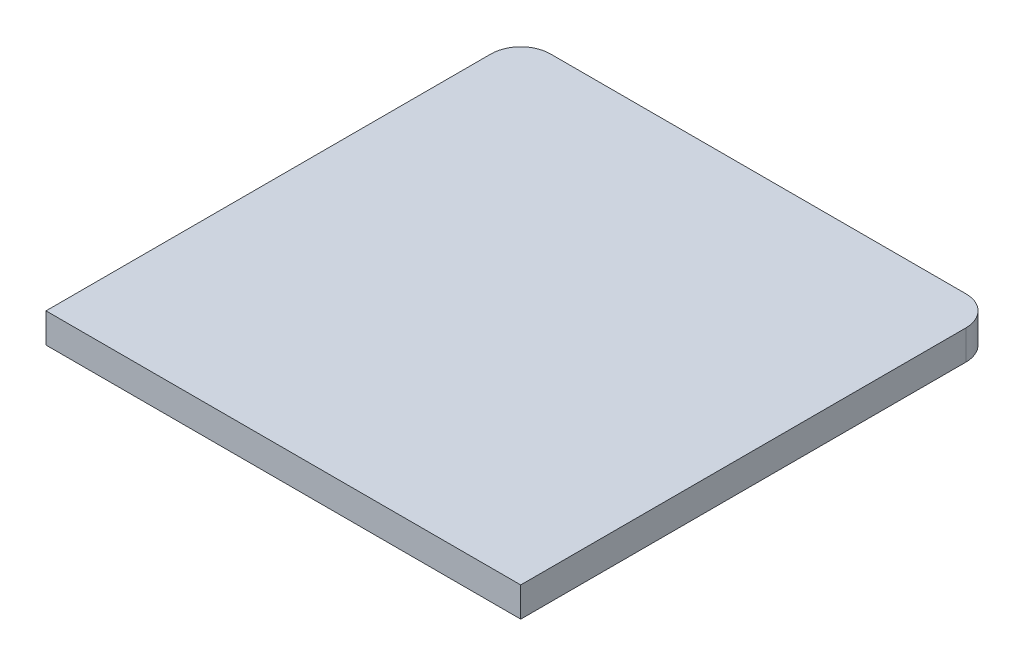
ISO-10303-21;
HEADER;
FILE_DESCRIPTION(('STEP AP214'),'2;1');
FILE_NAME('part.step','',(''),(''),'','','');
FILE_SCHEMA(('AUTOMOTIVE_DESIGN { 1 0 10303 214 1 1 1 1 }'));
ENDSEC;
DATA;
#1=APPLICATION_CONTEXT('core data for automotive mechanical design processes');
#2=APPLICATION_PROTOCOL_DEFINITION('international standard','automotive_design',2000,#1);
#3=PRODUCT_CONTEXT('',#1,'mechanical');
#4=PRODUCT('Part','Part','',(#3));
#5=PRODUCT_RELATED_PRODUCT_CATEGORY('part','',(#4));
#6=PRODUCT_DEFINITION_FORMATION('','',#4);
#7=PRODUCT_DEFINITION_CONTEXT('part definition',#1,'design');
#8=PRODUCT_DEFINITION('design','',#6,#7);
#9=PRODUCT_DEFINITION_SHAPE('','',#8);
#10=(LENGTH_UNIT() NAMED_UNIT(*) SI_UNIT(.MILLI.,.METRE.));
#11=(NAMED_UNIT(*) PLANE_ANGLE_UNIT() SI_UNIT($,.RADIAN.));
#12=(NAMED_UNIT(*) SI_UNIT($,.STERADIAN.) SOLID_ANGLE_UNIT());
#13=UNCERTAINTY_MEASURE_WITH_UNIT(LENGTH_MEASURE(1.E-05),#10,'distance_accuracy_value','');
#14=(GEOMETRIC_REPRESENTATION_CONTEXT(3) GLOBAL_UNCERTAINTY_ASSIGNED_CONTEXT((#13)) GLOBAL_UNIT_ASSIGNED_CONTEXT((#10,
#11,#12)) REPRESENTATION_CONTEXT('',''));
#15=CARTESIAN_POINT('',(0.,0.,0.));
#16=DIRECTION('',(0.,0.,1.));
#17=DIRECTION('',(1.,0.,0.));
#18=AXIS2_PLACEMENT_3D('',#15,#16,#17);
#19=CARTESIAN_POINT('',(0.,3.175,0.));
#20=DIRECTION('',(0.,0.,-1.));
#21=DIRECTION('',(-1.,0.,0.));
#22=AXIS2_PLACEMENT_3D('',#19,#20,#21);
#23=PLANE('',#22);
#24=DIRECTION('',(1.,0.,0.));
#25=VECTOR('',#24,1.);
#26=CARTESIAN_POINT('',(0.,0.,0.));
#27=LINE('',#26,#25);
#28=CARTESIAN_POINT('',(0.,0.,0.));
#29=VERTEX_POINT('',#28);
#30=CARTESIAN_POINT('',(50.8,0.,0.));
#31=VERTEX_POINT('',#30);
#32=EDGE_CURVE('E108',#29,#31,#27,.T.);
#33=ORIENTED_EDGE('',*,*,#32,.T.);
#34=DIRECTION('',(0.,-1.,0.));
#35=VECTOR('',#34,1.);
#36=CARTESIAN_POINT('',(50.8,3.175,0.));
#37=LINE('',#36,#35);
#38=CARTESIAN_POINT('',(50.8,3.175,0.));
#39=VERTEX_POINT('',#38);
#40=EDGE_CURVE('E94',#39,#31,#37,.T.);
#41=ORIENTED_EDGE('',*,*,#40,.F.);
#42=DIRECTION('',(1.,0.,0.));
#43=VECTOR('',#42,1.);
#44=CARTESIAN_POINT('',(0.,3.175,0.));
#45=LINE('',#44,#43);
#46=CARTESIAN_POINT('',(0.,3.175,0.));
#47=VERTEX_POINT('',#46);
#48=EDGE_CURVE('E97',#47,#39,#45,.T.);
#49=ORIENTED_EDGE('',*,*,#48,.F.);
#50=DIRECTION('',(0.,-1.,0.));
#51=VECTOR('',#50,1.);
#52=CARTESIAN_POINT('',(0.,3.175,0.));
#53=LINE('',#52,#51);
#54=EDGE_CURVE('E110',#47,#29,#53,.T.);
#55=ORIENTED_EDGE('',*,*,#54,.T.);
#56=EDGE_LOOP('',(#33,#41,#49,#55));
#57=FACE_BOUND('',#56,.T.);
#58=ADVANCED_FACE('F39',(#57),#23,.F.);
#59=CARTESIAN_POINT('',(50.8,3.175,0.));
#60=DIRECTION('',(-1.,0.,0.));
#61=DIRECTION('',(0.,0.,1.));
#62=AXIS2_PLACEMENT_3D('',#59,#60,#61);
#63=PLANE('',#62);
#64=DIRECTION('',(0.,0.,-1.));
#65=VECTOR('',#64,1.);
#66=CARTESIAN_POINT('',(50.8,0.,0.));
#67=LINE('',#66,#65);
#68=CARTESIAN_POINT('',(50.8,0.,-47.625));
#69=VERTEX_POINT('',#68);
#70=EDGE_CURVE('E144',#31,#69,#67,.T.);
#71=ORIENTED_EDGE('',*,*,#70,.T.);
#72=DIRECTION('',(0.,-1.,0.));
#73=VECTOR('',#72,1.);
#74=CARTESIAN_POINT('',(50.8,3.175,-47.625));
#75=LINE('',#74,#73);
#76=CARTESIAN_POINT('',(50.8,3.175,-47.625));
#77=VERTEX_POINT('',#76);
#78=EDGE_CURVE('E11',#69,#77,#75,.F.);
#79=ORIENTED_EDGE('',*,*,#78,.T.);
#80=DIRECTION('',(0.,0.,-1.));
#81=VECTOR('',#80,1.);
#82=CARTESIAN_POINT('',(50.8,3.175,0.));
#83=LINE('',#82,#81);
#84=EDGE_CURVE('E90',#39,#77,#83,.T.);
#85=ORIENTED_EDGE('',*,*,#84,.F.);
#86=ORIENTED_EDGE('',*,*,#40,.T.);
#87=EDGE_LOOP('',(#71,#79,#85,#86));
#88=FACE_BOUND('',#87,.T.);
#89=ADVANCED_FACE('F92',(#88),#63,.F.);
#90=CARTESIAN_POINT('',(0.,3.175,-50.8));
#91=DIRECTION('',(0.,0.,-1.));
#92=DIRECTION('',(-1.,0.,0.));
#93=AXIS2_PLACEMENT_3D('',#90,#91,#92);
#94=PLANE('',#93);
#95=DIRECTION('',(1.,0.,0.));
#96=VECTOR('',#95,1.);
#97=CARTESIAN_POINT('',(0.,0.,-50.8));
#98=LINE('',#97,#96);
#99=CARTESIAN_POINT('',(3.175,0.,-50.8));
#100=VERTEX_POINT('',#99);
#101=CARTESIAN_POINT('',(47.625,0.,-50.8));
#102=VERTEX_POINT('',#101);
#103=EDGE_CURVE('E140',#100,#102,#98,.T.);
#104=ORIENTED_EDGE('',*,*,#103,.F.);
#105=DIRECTION('',(0.,-1.,0.));
#106=VECTOR('',#105,1.);
#107=CARTESIAN_POINT('',(3.175,3.175,-50.8));
#108=LINE('',#107,#106);
#109=CARTESIAN_POINT('',(3.175,3.175,-50.8));
#110=VERTEX_POINT('',#109);
#111=EDGE_CURVE('E124',#100,#110,#108,.F.);
#112=ORIENTED_EDGE('',*,*,#111,.T.);
#113=DIRECTION('',(1.,0.,0.));
#114=VECTOR('',#113,1.);
#115=CARTESIAN_POINT('',(0.,3.175,-50.8));
#116=LINE('',#115,#114);
#117=CARTESIAN_POINT('',(47.625,3.175,-50.8));
#118=VERTEX_POINT('',#117);
#119=EDGE_CURVE('E96',#110,#118,#116,.T.);
#120=ORIENTED_EDGE('',*,*,#119,.T.);
#121=DIRECTION('',(0.,-1.,0.));
#122=VECTOR('',#121,1.);
#123=CARTESIAN_POINT('',(47.625,0.,-50.8));
#124=LINE('',#123,#122);
#125=EDGE_CURVE('E121',#118,#102,#124,.T.);
#126=ORIENTED_EDGE('',*,*,#125,.T.);
#127=EDGE_LOOP('',(#104,#112,#120,#126));
#128=FACE_BOUND('',#127,.T.);
#129=ADVANCED_FACE('F142',(#128),#94,.T.);
#130=CARTESIAN_POINT('',(0.,3.175,0.));
#131=DIRECTION('',(-1.,0.,0.));
#132=DIRECTION('',(0.,0.,1.));
#133=AXIS2_PLACEMENT_3D('',#130,#131,#132);
#134=PLANE('',#133);
#135=DIRECTION('',(0.,0.,-1.));
#136=VECTOR('',#135,1.);
#137=CARTESIAN_POINT('',(0.,3.175,0.));
#138=LINE('',#137,#136);
#139=CARTESIAN_POINT('',(0.,3.175,-47.625));
#140=VERTEX_POINT('',#139);
#141=EDGE_CURVE('E103',#47,#140,#138,.T.);
#142=ORIENTED_EDGE('',*,*,#141,.T.);
#143=DIRECTION('',(0.,-1.,0.));
#144=VECTOR('',#143,1.);
#145=CARTESIAN_POINT('',(0.,3.175,-47.625));
#146=LINE('',#145,#144);
#147=CARTESIAN_POINT('',(0.,0.,-47.625));
#148=VERTEX_POINT('',#147);
#149=EDGE_CURVE('E109',#140,#148,#146,.T.);
#150=ORIENTED_EDGE('',*,*,#149,.T.);
#151=DIRECTION('',(0.,0.,-1.));
#152=VECTOR('',#151,1.);
#153=CARTESIAN_POINT('',(0.,0.,0.));
#154=LINE('',#153,#152);
#155=EDGE_CURVE('E105',#29,#148,#154,.T.);
#156=ORIENTED_EDGE('',*,*,#155,.F.);
#157=ORIENTED_EDGE('',*,*,#54,.F.);
#158=EDGE_LOOP('',(#142,#150,#156,#157));
#159=FACE_BOUND('',#158,.T.);
#160=ADVANCED_FACE('F131',(#159),#134,.T.);
#161=CARTESIAN_POINT('',(0.,3.175,0.));
#162=DIRECTION('',(0.,1.,0.));
#163=DIRECTION('',(0.,0.,1.));
#164=AXIS2_PLACEMENT_3D('',#161,#162,#163);
#165=PLANE('',#164);
#166=ORIENTED_EDGE('',*,*,#119,.F.);
#167=CARTESIAN_POINT('',(3.175,3.175,-47.625));
#168=DIRECTION('',(0.,1.,0.));
#169=DIRECTION('',(0.,0.,1.));
#170=AXIS2_PLACEMENT_3D('',#167,#168,#169);
#171=CIRCLE('',#170,3.175);
#172=EDGE_CURVE('E47',#110,#140,#171,.T.);
#173=ORIENTED_EDGE('',*,*,#172,.T.);
#174=ORIENTED_EDGE('',*,*,#141,.F.);
#175=ORIENTED_EDGE('',*,*,#48,.T.);
#176=ORIENTED_EDGE('',*,*,#84,.T.);
#177=CARTESIAN_POINT('',(47.625,3.175,-47.625));
#178=DIRECTION('',(0.,1.,0.));
#179=DIRECTION('',(0.,0.,1.));
#180=AXIS2_PLACEMENT_3D('',#177,#178,#179);
#181=CIRCLE('',#180,3.175);
#182=EDGE_CURVE('E59',#77,#118,#181,.T.);
#183=ORIENTED_EDGE('',*,*,#182,.T.);
#184=EDGE_LOOP('',(#166,#173,#174,#175,#176,#183));
#185=FACE_BOUND('',#184,.T.);
#186=ADVANCED_FACE('F101',(#185),#165,.T.);
#187=CARTESIAN_POINT('',(0.,0.,0.));
#188=DIRECTION('',(0.,1.,0.));
#189=DIRECTION('',(0.,0.,1.));
#190=AXIS2_PLACEMENT_3D('',#187,#188,#189);
#191=PLANE('',#190);
#192=ORIENTED_EDGE('',*,*,#155,.T.);
#193=CARTESIAN_POINT('',(3.175,0.,-47.625));
#194=DIRECTION('',(0.,1.,0.));
#195=DIRECTION('',(0.,0.,1.));
#196=AXIS2_PLACEMENT_3D('',#193,#194,#195);
#197=CIRCLE('',#196,3.175);
#198=EDGE_CURVE('E119',#148,#100,#197,.F.);
#199=ORIENTED_EDGE('',*,*,#198,.T.);
#200=ORIENTED_EDGE('',*,*,#103,.T.);
#201=CARTESIAN_POINT('',(47.625,0.,-47.625));
#202=DIRECTION('',(0.,1.,0.));
#203=DIRECTION('',(0.,0.,1.));
#204=AXIS2_PLACEMENT_3D('',#201,#202,#203);
#205=CIRCLE('',#204,3.175);
#206=EDGE_CURVE('E113',#102,#69,#205,.F.);
#207=ORIENTED_EDGE('',*,*,#206,.T.);
#208=ORIENTED_EDGE('',*,*,#70,.F.);
#209=ORIENTED_EDGE('',*,*,#32,.F.);
#210=EDGE_LOOP('',(#192,#199,#200,#207,#208,#209));
#211=FACE_BOUND('',#210,.T.);
#212=ADVANCED_FACE('F139',(#211),#191,.F.);
#213=CARTESIAN_POINT('',(3.175,3.175,-47.625));
#214=DIRECTION('',(0.,-1.,0.));
#215=DIRECTION('',(0.,0.,-1.));
#216=AXIS2_PLACEMENT_3D('',#213,#214,#215);
#217=CYLINDRICAL_SURFACE('',#216,3.175);
#218=ORIENTED_EDGE('',*,*,#172,.F.);
#219=ORIENTED_EDGE('',*,*,#111,.F.);
#220=ORIENTED_EDGE('',*,*,#198,.F.);
#221=ORIENTED_EDGE('',*,*,#149,.F.);
#222=EDGE_LOOP('',(#218,#219,#220,#221));
#223=FACE_BOUND('',#222,.T.);
#224=ADVANCED_FACE('F135',(#223),#217,.T.);
#225=CARTESIAN_POINT('',(47.625,3.175,-47.625));
#226=DIRECTION('',(0.,1.,0.));
#227=DIRECTION('',(0.,0.,1.));
#228=AXIS2_PLACEMENT_3D('',#225,#226,#227);
#229=CYLINDRICAL_SURFACE('',#228,3.175);
#230=ORIENTED_EDGE('',*,*,#182,.F.);
#231=ORIENTED_EDGE('',*,*,#78,.F.);
#232=ORIENTED_EDGE('',*,*,#206,.F.);
#233=ORIENTED_EDGE('',*,*,#125,.F.);
#234=EDGE_LOOP('',(#230,#231,#232,#233));
#235=FACE_BOUND('',#234,.T.);
#236=ADVANCED_FACE('F41',(#235),#229,.T.);
#237=CLOSED_SHELL('',(#58,#89,#129,#160,#186,#212,#224,#236));
#238=MANIFOLD_SOLID_BREP('B2',#237);
#239=ADVANCED_BREP_SHAPE_REPRESENTATION('',(#18,#238),#14);
#240=SHAPE_DEFINITION_REPRESENTATION(#9,#239);
ENDSEC;
END-ISO-10303-21;
